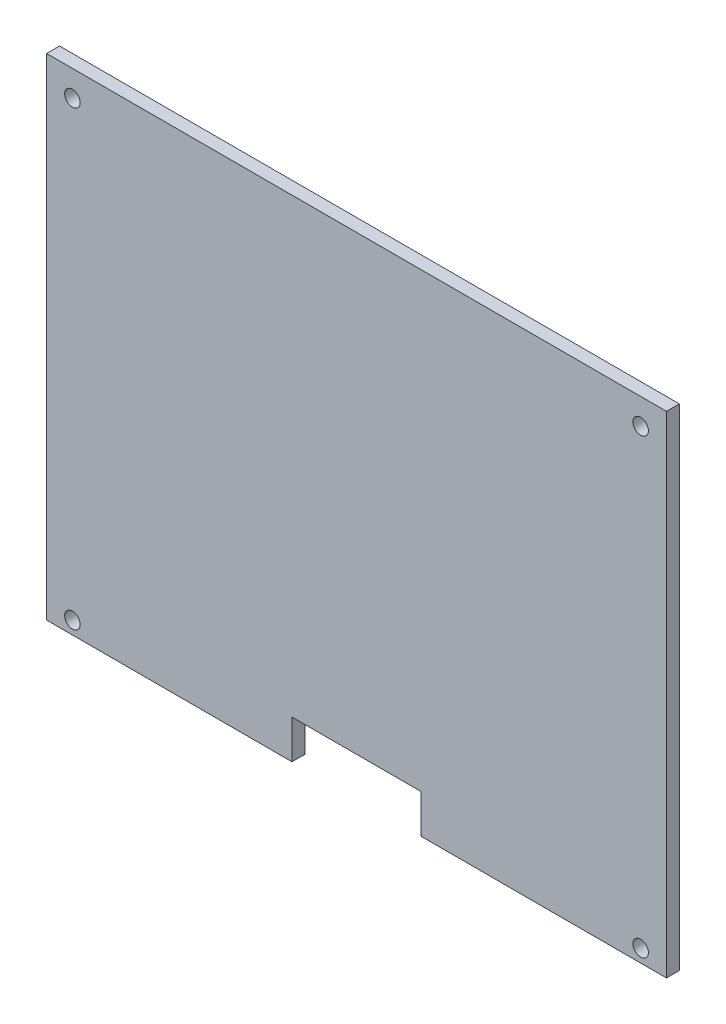
ISO-10303-21;
HEADER;
FILE_DESCRIPTION(('STEP AP214'),'2;1');
FILE_NAME('part.step','',(''),(''),'','','');
FILE_SCHEMA(('AUTOMOTIVE_DESIGN { 1 0 10303 214 1 1 1 1 }'));
ENDSEC;
DATA;
#1=APPLICATION_CONTEXT('core data for automotive mechanical design processes');
#2=APPLICATION_PROTOCOL_DEFINITION('international standard','automotive_design',2000,#1);
#3=PRODUCT_CONTEXT('',#1,'mechanical');
#4=PRODUCT('Part','Part','',(#3));
#5=PRODUCT_RELATED_PRODUCT_CATEGORY('part','',(#4));
#6=PRODUCT_DEFINITION_FORMATION('','',#4);
#7=PRODUCT_DEFINITION_CONTEXT('part definition',#1,'design');
#8=PRODUCT_DEFINITION('design','',#6,#7);
#9=PRODUCT_DEFINITION_SHAPE('','',#8);
#10=(LENGTH_UNIT() NAMED_UNIT(*) SI_UNIT(.MILLI.,.METRE.));
#11=(NAMED_UNIT(*) PLANE_ANGLE_UNIT() SI_UNIT($,.RADIAN.));
#12=(NAMED_UNIT(*) SI_UNIT($,.STERADIAN.) SOLID_ANGLE_UNIT());
#13=UNCERTAINTY_MEASURE_WITH_UNIT(LENGTH_MEASURE(1.E-05),#10,'distance_accuracy_value','');
#14=(GEOMETRIC_REPRESENTATION_CONTEXT(3) GLOBAL_UNCERTAINTY_ASSIGNED_CONTEXT((#13)) GLOBAL_UNIT_ASSIGNED_CONTEXT((#10,
#11,#12)) REPRESENTATION_CONTEXT('',''));
#15=CARTESIAN_POINT('',(0.,0.,0.));
#16=DIRECTION('',(0.,0.,1.));
#17=DIRECTION('',(1.,0.,0.));
#18=AXIS2_PLACEMENT_3D('',#15,#16,#17);
#19=CARTESIAN_POINT('',(0.,-190.,5.));
#20=DIRECTION('',(0.,1.,0.));
#21=DIRECTION('',(0.,0.,1.));
#22=AXIS2_PLACEMENT_3D('',#19,#20,#21);
#23=PLANE('',#22);
#24=DIRECTION('',(0.,0.,1.));
#25=VECTOR('',#24,1.);
#26=CARTESIAN_POINT('',(145.,-190.,0.));
#27=LINE('',#26,#25);
#28=CARTESIAN_POINT('',(145.,-190.,0.));
#29=VERTEX_POINT('',#28);
#30=CARTESIAN_POINT('',(145.,-190.,5.));
#31=VERTEX_POINT('',#30);
#32=EDGE_CURVE('E113',#29,#31,#27,.T.);
#33=ORIENTED_EDGE('',*,*,#32,.F.);
#34=DIRECTION('',(1.,0.,0.));
#35=VECTOR('',#34,1.);
#36=CARTESIAN_POINT('',(0.,-190.,0.));
#37=LINE('',#36,#35);
#38=CARTESIAN_POINT('',(240.,-190.,0.));
#39=VERTEX_POINT('',#38);
#40=EDGE_CURVE('E125',#29,#39,#37,.T.);
#41=ORIENTED_EDGE('',*,*,#40,.T.);
#42=DIRECTION('',(0.,0.,-1.));
#43=VECTOR('',#42,1.);
#44=CARTESIAN_POINT('',(240.,-190.,5.));
#45=LINE('',#44,#43);
#46=CARTESIAN_POINT('',(240.,-190.,5.));
#47=VERTEX_POINT('',#46);
#48=EDGE_CURVE('E41',#47,#39,#45,.T.);
#49=ORIENTED_EDGE('',*,*,#48,.F.);
#50=DIRECTION('',(1.,0.,0.));
#51=VECTOR('',#50,1.);
#52=CARTESIAN_POINT('',(0.,-190.,5.));
#53=LINE('',#52,#51);
#54=EDGE_CURVE('E127',#31,#47,#53,.T.);
#55=ORIENTED_EDGE('',*,*,#54,.F.);
#56=EDGE_LOOP('',(#33,#41,#49,#55));
#57=FACE_BOUND('',#56,.T.);
#58=ADVANCED_FACE('F32',(#57),#23,.F.);
#59=DIRECTION('',(0.,0.,1.));
#60=VECTOR('',#59,1.);
#61=CARTESIAN_POINT('',(95.,-190.,0.));
#62=LINE('',#61,#60);
#63=CARTESIAN_POINT('',(95.,-190.,0.));
#64=VERTEX_POINT('',#63);
#65=CARTESIAN_POINT('',(95.,-190.,5.));
#66=VERTEX_POINT('',#65);
#67=EDGE_CURVE('E129',#64,#66,#62,.T.);
#68=ORIENTED_EDGE('',*,*,#67,.T.);
#69=CARTESIAN_POINT('',(0.,-190.,5.));
#70=VERTEX_POINT('',#69);
#71=EDGE_CURVE('E86',#70,#66,#53,.T.);
#72=ORIENTED_EDGE('',*,*,#71,.F.);
#73=DIRECTION('',(0.,0.,-1.));
#74=VECTOR('',#73,1.);
#75=CARTESIAN_POINT('',(0.,-190.,5.));
#76=LINE('',#75,#74);
#77=CARTESIAN_POINT('',(0.,-190.,0.));
#78=VERTEX_POINT('',#77);
#79=EDGE_CURVE('E11',#70,#78,#76,.T.);
#80=ORIENTED_EDGE('',*,*,#79,.T.);
#81=EDGE_CURVE('E134',#78,#64,#37,.T.);
#82=ORIENTED_EDGE('',*,*,#81,.T.);
#83=EDGE_LOOP('',(#68,#72,#80,#82));
#84=FACE_BOUND('',#83,.T.);
#85=ADVANCED_FACE('F192',(#84),#23,.F.);
#86=CARTESIAN_POINT('',(0.,0.,5.));
#87=DIRECTION('',(0.,0.,1.));
#88=DIRECTION('',(1.,0.,0.));
#89=AXIS2_PLACEMENT_3D('',#86,#87,#88);
#90=PLANE('',#89);
#91=CARTESIAN_POINT('',(230.,-10.,5.));
#92=DIRECTION('',(0.,0.,1.));
#93=DIRECTION('',(-1.,0.,0.));
#94=AXIS2_PLACEMENT_3D('',#91,#92,#93);
#95=CIRCLE('',#94,2.99999999999999);
#96=CARTESIAN_POINT('',(227.,-10.,5.));
#97=VERTEX_POINT('',#96);
#98=EDGE_CURVE('E197',#97,#97,#95,.T.);
#99=ORIENTED_EDGE('',*,*,#98,.F.);
#100=EDGE_LOOP('',(#99));
#101=FACE_BOUND('',#100,.T.);
#102=CARTESIAN_POINT('',(230.,-185.,5.));
#103=DIRECTION('',(0.,0.,1.));
#104=DIRECTION('',(-1.,0.,0.));
#105=AXIS2_PLACEMENT_3D('',#102,#103,#104);
#106=CIRCLE('',#105,3.00000000000002);
#107=CARTESIAN_POINT('',(227.,-185.,5.));
#108=VERTEX_POINT('',#107);
#109=EDGE_CURVE('E200',#108,#108,#106,.T.);
#110=ORIENTED_EDGE('',*,*,#109,.F.);
#111=EDGE_LOOP('',(#110));
#112=FACE_BOUND('',#111,.T.);
#113=CARTESIAN_POINT('',(10.,-185.,5.));
#114=DIRECTION('',(0.,0.,1.));
#115=DIRECTION('',(1.,0.,0.));
#116=AXIS2_PLACEMENT_3D('',#113,#114,#115);
#117=CIRCLE('',#116,3.);
#118=CARTESIAN_POINT('',(13.,-185.,5.));
#119=VERTEX_POINT('',#118);
#120=EDGE_CURVE('E196',#119,#119,#117,.T.);
#121=ORIENTED_EDGE('',*,*,#120,.F.);
#122=EDGE_LOOP('',(#121));
#123=FACE_BOUND('',#122,.T.);
#124=CARTESIAN_POINT('',(10.,-10.,5.));
#125=DIRECTION('',(0.,0.,1.));
#126=DIRECTION('',(1.,0.,0.));
#127=AXIS2_PLACEMENT_3D('',#124,#125,#126);
#128=CIRCLE('',#127,3.);
#129=CARTESIAN_POINT('',(13.,-10.,5.));
#130=VERTEX_POINT('',#129);
#131=EDGE_CURVE('E153',#130,#130,#128,.T.);
#132=ORIENTED_EDGE('',*,*,#131,.F.);
#133=EDGE_LOOP('',(#132));
#134=FACE_BOUND('',#133,.T.);
#135=DIRECTION('',(1.,0.,0.));
#136=VECTOR('',#135,1.);
#137=CARTESIAN_POINT('',(95.,-175.,5.));
#138=LINE('',#137,#136);
#139=CARTESIAN_POINT('',(95.,-175.,5.));
#140=VERTEX_POINT('',#139);
#141=CARTESIAN_POINT('',(145.,-175.,5.));
#142=VERTEX_POINT('',#141);
#143=EDGE_CURVE('E120',#140,#142,#138,.T.);
#144=ORIENTED_EDGE('',*,*,#143,.T.);
#145=DIRECTION('',(0.,-1.,0.));
#146=VECTOR('',#145,1.);
#147=CARTESIAN_POINT('',(145.,-175.,5.));
#148=LINE('',#147,#146);
#149=EDGE_CURVE('E160',#142,#31,#148,.T.);
#150=ORIENTED_EDGE('',*,*,#149,.T.);
#151=ORIENTED_EDGE('',*,*,#54,.T.);
#152=DIRECTION('',(0.,1.,0.));
#153=VECTOR('',#152,1.);
#154=CARTESIAN_POINT('',(240.,0.,5.));
#155=LINE('',#154,#153);
#156=CARTESIAN_POINT('',(240.,0.,5.));
#157=VERTEX_POINT('',#156);
#158=EDGE_CURVE('E178',#47,#157,#155,.T.);
#159=ORIENTED_EDGE('',*,*,#158,.T.);
#160=DIRECTION('',(-1.,0.,0.));
#161=VECTOR('',#160,1.);
#162=CARTESIAN_POINT('',(0.,0.,5.));
#163=LINE('',#162,#161);
#164=CARTESIAN_POINT('',(0.,0.,5.));
#165=VERTEX_POINT('',#164);
#166=EDGE_CURVE('E58',#157,#165,#163,.T.);
#167=ORIENTED_EDGE('',*,*,#166,.T.);
#168=DIRECTION('',(0.,-1.,0.));
#169=VECTOR('',#168,1.);
#170=CARTESIAN_POINT('',(0.,0.,5.));
#171=LINE('',#170,#169);
#172=EDGE_CURVE('E143',#165,#70,#171,.T.);
#173=ORIENTED_EDGE('',*,*,#172,.T.);
#174=ORIENTED_EDGE('',*,*,#71,.T.);
#175=DIRECTION('',(0.,1.,0.));
#176=VECTOR('',#175,1.);
#177=CARTESIAN_POINT('',(95.,-190.,5.));
#178=LINE('',#177,#176);
#179=EDGE_CURVE('E163',#66,#140,#178,.T.);
#180=ORIENTED_EDGE('',*,*,#179,.T.);
#181=EDGE_LOOP('',(#144,#150,#151,#159,#167,#173,#174,#180));
#182=FACE_BOUND('',#181,.T.);
#183=ADVANCED_FACE('F181',(#101,#112,#123,#134,#182),#90,.T.);
#184=CARTESIAN_POINT('',(0.,0.,0.));
#185=DIRECTION('',(0.,0.,1.));
#186=DIRECTION('',(1.,0.,0.));
#187=AXIS2_PLACEMENT_3D('',#184,#185,#186);
#188=PLANE('',#187);
#189=CARTESIAN_POINT('',(230.,-10.,0.));
#190=DIRECTION('',(0.,0.,1.));
#191=DIRECTION('',(1.,0.,0.));
#192=AXIS2_PLACEMENT_3D('',#189,#190,#191);
#193=CIRCLE('',#192,2.99999999999999);
#194=CARTESIAN_POINT('',(233.,-10.,0.));
#195=VERTEX_POINT('',#194);
#196=EDGE_CURVE('E36',#195,#195,#193,.T.);
#197=ORIENTED_EDGE('',*,*,#196,.T.);
#198=EDGE_LOOP('',(#197));
#199=FACE_BOUND('',#198,.T.);
#200=CARTESIAN_POINT('',(230.,-185.,0.));
#201=DIRECTION('',(0.,0.,1.));
#202=DIRECTION('',(1.,0.,0.));
#203=AXIS2_PLACEMENT_3D('',#200,#201,#202);
#204=CIRCLE('',#203,3.00000000000002);
#205=CARTESIAN_POINT('',(233.,-185.,0.));
#206=VERTEX_POINT('',#205);
#207=EDGE_CURVE('E155',#206,#206,#204,.T.);
#208=ORIENTED_EDGE('',*,*,#207,.T.);
#209=EDGE_LOOP('',(#208));
#210=FACE_BOUND('',#209,.T.);
#211=CARTESIAN_POINT('',(10.,-185.,0.));
#212=DIRECTION('',(0.,0.,1.));
#213=DIRECTION('',(1.,0.,0.));
#214=AXIS2_PLACEMENT_3D('',#211,#212,#213);
#215=CIRCLE('',#214,3.);
#216=CARTESIAN_POINT('',(13.,-185.,0.));
#217=VERTEX_POINT('',#216);
#218=EDGE_CURVE('E152',#217,#217,#215,.T.);
#219=ORIENTED_EDGE('',*,*,#218,.T.);
#220=EDGE_LOOP('',(#219));
#221=FACE_BOUND('',#220,.T.);
#222=CARTESIAN_POINT('',(10.,-10.,0.));
#223=DIRECTION('',(0.,0.,1.));
#224=DIRECTION('',(1.,0.,0.));
#225=AXIS2_PLACEMENT_3D('',#222,#223,#224);
#226=CIRCLE('',#225,3.);
#227=CARTESIAN_POINT('',(13.,-10.,0.));
#228=VERTEX_POINT('',#227);
#229=EDGE_CURVE('E149',#228,#228,#226,.T.);
#230=ORIENTED_EDGE('',*,*,#229,.T.);
#231=EDGE_LOOP('',(#230));
#232=FACE_BOUND('',#231,.T.);
#233=DIRECTION('',(0.,-1.,0.));
#234=VECTOR('',#233,1.);
#235=CARTESIAN_POINT('',(145.,-175.,0.));
#236=LINE('',#235,#234);
#237=CARTESIAN_POINT('',(145.,-175.,0.));
#238=VERTEX_POINT('',#237);
#239=EDGE_CURVE('E109',#238,#29,#236,.T.);
#240=ORIENTED_EDGE('',*,*,#239,.F.);
#241=DIRECTION('',(1.,0.,0.));
#242=VECTOR('',#241,1.);
#243=CARTESIAN_POINT('',(95.,-175.,0.));
#244=LINE('',#243,#242);
#245=CARTESIAN_POINT('',(95.,-175.,0.));
#246=VERTEX_POINT('',#245);
#247=EDGE_CURVE('E169',#246,#238,#244,.T.);
#248=ORIENTED_EDGE('',*,*,#247,.F.);
#249=DIRECTION('',(0.,1.,0.));
#250=VECTOR('',#249,1.);
#251=CARTESIAN_POINT('',(95.,-190.,0.));
#252=LINE('',#251,#250);
#253=EDGE_CURVE('E119',#64,#246,#252,.T.);
#254=ORIENTED_EDGE('',*,*,#253,.F.);
#255=ORIENTED_EDGE('',*,*,#81,.F.);
#256=DIRECTION('',(0.,-1.,0.));
#257=VECTOR('',#256,1.);
#258=CARTESIAN_POINT('',(0.,0.,0.));
#259=LINE('',#258,#257);
#260=CARTESIAN_POINT('',(0.,0.,0.));
#261=VERTEX_POINT('',#260);
#262=EDGE_CURVE('E128',#261,#78,#259,.T.);
#263=ORIENTED_EDGE('',*,*,#262,.F.);
#264=DIRECTION('',(-1.,0.,0.));
#265=VECTOR('',#264,1.);
#266=CARTESIAN_POINT('',(0.,0.,0.));
#267=LINE('',#266,#265);
#268=CARTESIAN_POINT('',(240.,0.,0.));
#269=VERTEX_POINT('',#268);
#270=EDGE_CURVE('E79',#269,#261,#267,.T.);
#271=ORIENTED_EDGE('',*,*,#270,.F.);
#272=DIRECTION('',(0.,1.,0.));
#273=VECTOR('',#272,1.);
#274=CARTESIAN_POINT('',(240.,0.,0.));
#275=LINE('',#274,#273);
#276=EDGE_CURVE('E133',#39,#269,#275,.T.);
#277=ORIENTED_EDGE('',*,*,#276,.F.);
#278=ORIENTED_EDGE('',*,*,#40,.F.);
#279=EDGE_LOOP('',(#240,#248,#254,#255,#263,#271,#277,#278));
#280=FACE_BOUND('',#279,.T.);
#281=ADVANCED_FACE('F132',(#199,#210,#221,#232,#280),#188,.F.);
#282=CARTESIAN_POINT('',(0.,0.,5.));
#283=DIRECTION('',(1.,0.,0.));
#284=DIRECTION('',(0.,1.,0.));
#285=AXIS2_PLACEMENT_3D('',#282,#283,#284);
#286=PLANE('',#285);
#287=ORIENTED_EDGE('',*,*,#262,.T.);
#288=ORIENTED_EDGE('',*,*,#79,.F.);
#289=ORIENTED_EDGE('',*,*,#172,.F.);
#290=DIRECTION('',(0.,0.,-1.));
#291=VECTOR('',#290,1.);
#292=CARTESIAN_POINT('',(0.,0.,5.));
#293=LINE('',#292,#291);
#294=EDGE_CURVE('E144',#165,#261,#293,.T.);
#295=ORIENTED_EDGE('',*,*,#294,.T.);
#296=EDGE_LOOP('',(#287,#288,#289,#295));
#297=FACE_BOUND('',#296,.T.);
#298=ADVANCED_FACE('F34',(#297),#286,.F.);
#299=CARTESIAN_POINT('',(240.,0.,5.));
#300=DIRECTION('',(-1.,0.,0.));
#301=DIRECTION('',(0.,-1.,0.));
#302=AXIS2_PLACEMENT_3D('',#299,#300,#301);
#303=PLANE('',#302);
#304=ORIENTED_EDGE('',*,*,#276,.T.);
#305=DIRECTION('',(0.,0.,-1.));
#306=VECTOR('',#305,1.);
#307=CARTESIAN_POINT('',(240.,0.,5.));
#308=LINE('',#307,#306);
#309=EDGE_CURVE('E146',#157,#269,#308,.T.);
#310=ORIENTED_EDGE('',*,*,#309,.F.);
#311=ORIENTED_EDGE('',*,*,#158,.F.);
#312=ORIENTED_EDGE('',*,*,#48,.T.);
#313=EDGE_LOOP('',(#304,#310,#311,#312));
#314=FACE_BOUND('',#313,.T.);
#315=ADVANCED_FACE('F183',(#314),#303,.F.);
#316=CARTESIAN_POINT('',(0.,0.,5.));
#317=DIRECTION('',(0.,-1.,0.));
#318=DIRECTION('',(0.,0.,-1.));
#319=AXIS2_PLACEMENT_3D('',#316,#317,#318);
#320=PLANE('',#319);
#321=ORIENTED_EDGE('',*,*,#270,.T.);
#322=ORIENTED_EDGE('',*,*,#294,.F.);
#323=ORIENTED_EDGE('',*,*,#166,.F.);
#324=ORIENTED_EDGE('',*,*,#309,.T.);
#325=EDGE_LOOP('',(#321,#322,#323,#324));
#326=FACE_BOUND('',#325,.T.);
#327=ADVANCED_FACE('F184',(#326),#320,.F.);
#328=CARTESIAN_POINT('',(145.,-175.,0.));
#329=DIRECTION('',(-1.,0.,0.));
#330=DIRECTION('',(0.,0.,1.));
#331=AXIS2_PLACEMENT_3D('',#328,#329,#330);
#332=PLANE('',#331);
#333=ORIENTED_EDGE('',*,*,#149,.F.);
#334=DIRECTION('',(0.,0.,1.));
#335=VECTOR('',#334,1.);
#336=CARTESIAN_POINT('',(145.,-175.,0.));
#337=LINE('',#336,#335);
#338=EDGE_CURVE('E115',#238,#142,#337,.T.);
#339=ORIENTED_EDGE('',*,*,#338,.F.);
#340=ORIENTED_EDGE('',*,*,#239,.T.);
#341=ORIENTED_EDGE('',*,*,#32,.T.);
#342=EDGE_LOOP('',(#333,#339,#340,#341));
#343=FACE_BOUND('',#342,.T.);
#344=ADVANCED_FACE('F112',(#343),#332,.T.);
#345=CARTESIAN_POINT('',(95.,-190.,0.));
#346=DIRECTION('',(1.,0.,0.));
#347=DIRECTION('',(0.,0.,-1.));
#348=AXIS2_PLACEMENT_3D('',#345,#346,#347);
#349=PLANE('',#348);
#350=ORIENTED_EDGE('',*,*,#179,.F.);
#351=ORIENTED_EDGE('',*,*,#67,.F.);
#352=ORIENTED_EDGE('',*,*,#253,.T.);
#353=DIRECTION('',(0.,0.,1.));
#354=VECTOR('',#353,1.);
#355=CARTESIAN_POINT('',(95.,-175.,0.));
#356=LINE('',#355,#354);
#357=EDGE_CURVE('E49',#246,#140,#356,.T.);
#358=ORIENTED_EDGE('',*,*,#357,.T.);
#359=EDGE_LOOP('',(#350,#351,#352,#358));
#360=FACE_BOUND('',#359,.T.);
#361=ADVANCED_FACE('F190',(#360),#349,.T.);
#362=CARTESIAN_POINT('',(95.,-175.,0.));
#363=DIRECTION('',(0.,-1.,0.));
#364=DIRECTION('',(0.,0.,-1.));
#365=AXIS2_PLACEMENT_3D('',#362,#363,#364);
#366=PLANE('',#365);
#367=ORIENTED_EDGE('',*,*,#143,.F.);
#368=ORIENTED_EDGE('',*,*,#357,.F.);
#369=ORIENTED_EDGE('',*,*,#247,.T.);
#370=ORIENTED_EDGE('',*,*,#338,.T.);
#371=EDGE_LOOP('',(#367,#368,#369,#370));
#372=FACE_BOUND('',#371,.T.);
#373=ADVANCED_FACE('F218',(#372),#366,.T.);
#374=CARTESIAN_POINT('',(10.,-10.,-5.));
#375=DIRECTION('',(0.,0.,1.));
#376=DIRECTION('',(1.,0.,0.));
#377=AXIS2_PLACEMENT_3D('',#374,#375,#376);
#378=CYLINDRICAL_SURFACE('',#377,3.);
#379=ORIENTED_EDGE('',*,*,#131,.T.);
#380=EDGE_LOOP('',(#379));
#381=FACE_BOUND('',#380,.T.);
#382=ORIENTED_EDGE('',*,*,#229,.F.);
#383=EDGE_LOOP('',(#382));
#384=FACE_BOUND('',#383,.T.);
#385=ADVANCED_FACE('F215',(#381,#384),#378,.F.);
#386=CARTESIAN_POINT('',(10.,-185.,-5.));
#387=DIRECTION('',(0.,0.,1.));
#388=DIRECTION('',(1.,0.,0.));
#389=AXIS2_PLACEMENT_3D('',#386,#387,#388);
#390=CYLINDRICAL_SURFACE('',#389,3.);
#391=ORIENTED_EDGE('',*,*,#120,.T.);
#392=EDGE_LOOP('',(#391));
#393=FACE_BOUND('',#392,.T.);
#394=ORIENTED_EDGE('',*,*,#218,.F.);
#395=EDGE_LOOP('',(#394));
#396=FACE_BOUND('',#395,.T.);
#397=ADVANCED_FACE('F206',(#393,#396),#390,.F.);
#398=CARTESIAN_POINT('',(230.,-185.,-5.));
#399=DIRECTION('',(0.,0.,1.));
#400=DIRECTION('',(1.,0.,0.));
#401=AXIS2_PLACEMENT_3D('',#398,#399,#400);
#402=CYLINDRICAL_SURFACE('',#401,3.00000000000002);
#403=ORIENTED_EDGE('',*,*,#109,.T.);
#404=EDGE_LOOP('',(#403));
#405=FACE_BOUND('',#404,.T.);
#406=ORIENTED_EDGE('',*,*,#207,.F.);
#407=EDGE_LOOP('',(#406));
#408=FACE_BOUND('',#407,.T.);
#409=ADVANCED_FACE('F249',(#405,#408),#402,.F.);
#410=CARTESIAN_POINT('',(230.,-10.,-5.));
#411=DIRECTION('',(0.,0.,1.));
#412=DIRECTION('',(1.,0.,0.));
#413=AXIS2_PLACEMENT_3D('',#410,#411,#412);
#414=CYLINDRICAL_SURFACE('',#413,2.99999999999999);
#415=ORIENTED_EDGE('',*,*,#98,.T.);
#416=EDGE_LOOP('',(#415));
#417=FACE_BOUND('',#416,.T.);
#418=ORIENTED_EDGE('',*,*,#196,.F.);
#419=EDGE_LOOP('',(#418));
#420=FACE_BOUND('',#419,.T.);
#421=ADVANCED_FACE('F246',(#417,#420),#414,.F.);
#422=CLOSED_SHELL('',(#58,#85,#183,#281,#298,#315,#327,#344,#361,#373,#385,#397,#409,#421));
#423=MANIFOLD_SOLID_BREP('B2',#422);
#424=ADVANCED_BREP_SHAPE_REPRESENTATION('',(#18,#423),#14);
#425=SHAPE_DEFINITION_REPRESENTATION(#9,#424);
ENDSEC;
END-ISO-10303-21;
